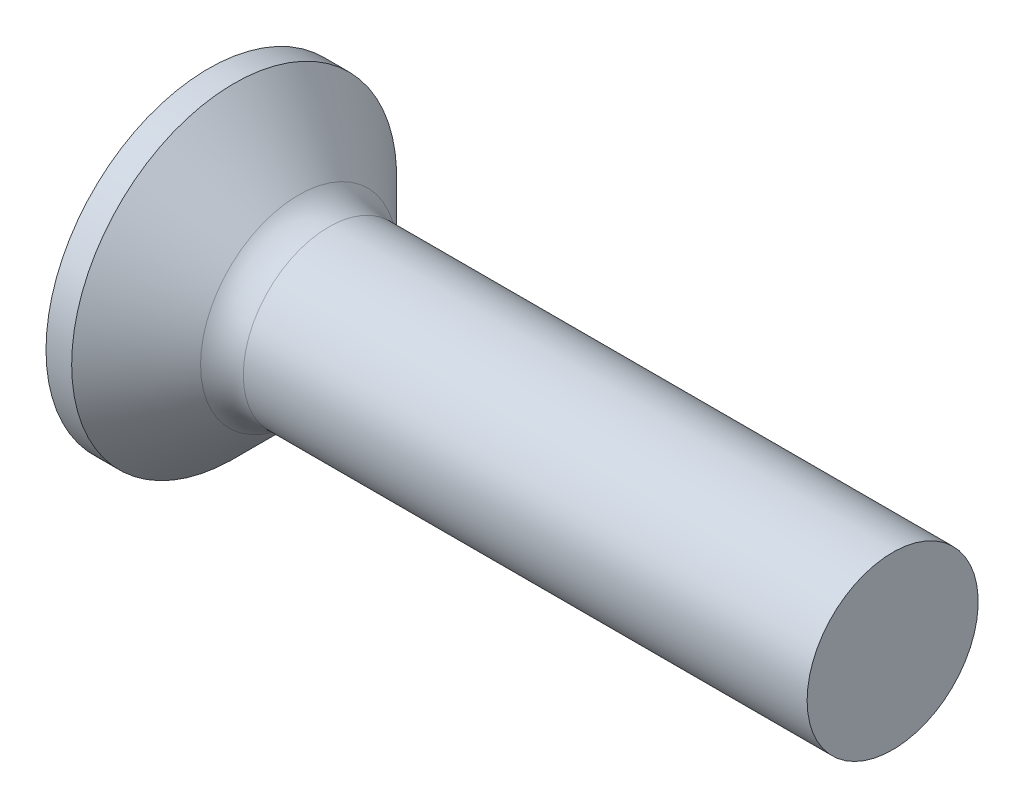
ISO-10303-21;
HEADER;
FILE_DESCRIPTION(('STEP AP214'),'2;1');
FILE_NAME('part.step','',(''),(''),'','','');
FILE_SCHEMA(('AUTOMOTIVE_DESIGN { 1 0 10303 214 1 1 1 1 }'));
ENDSEC;
DATA;
#1=APPLICATION_CONTEXT('core data for automotive mechanical design processes');
#2=APPLICATION_PROTOCOL_DEFINITION('international standard','automotive_design',2000,#1);
#3=PRODUCT_CONTEXT('',#1,'mechanical');
#4=PRODUCT('Part','Part','',(#3));
#5=PRODUCT_RELATED_PRODUCT_CATEGORY('part','',(#4));
#6=PRODUCT_DEFINITION_FORMATION('','',#4);
#7=PRODUCT_DEFINITION_CONTEXT('part definition',#1,'design');
#8=PRODUCT_DEFINITION('design','',#6,#7);
#9=PRODUCT_DEFINITION_SHAPE('','',#8);
#10=(LENGTH_UNIT() NAMED_UNIT(*) SI_UNIT(.MILLI.,.METRE.));
#11=(NAMED_UNIT(*) PLANE_ANGLE_UNIT() SI_UNIT($,.RADIAN.));
#12=(NAMED_UNIT(*) SI_UNIT($,.STERADIAN.) SOLID_ANGLE_UNIT());
#13=UNCERTAINTY_MEASURE_WITH_UNIT(LENGTH_MEASURE(1.E-05),#10,'distance_accuracy_value','');
#14=(GEOMETRIC_REPRESENTATION_CONTEXT(3) GLOBAL_UNCERTAINTY_ASSIGNED_CONTEXT((#13)) GLOBAL_UNIT_ASSIGNED_CONTEXT((#10,
#11,#12)) REPRESENTATION_CONTEXT('',''));
#15=CARTESIAN_POINT('',(0.,0.,0.));
#16=DIRECTION('',(0.,0.,1.));
#17=DIRECTION('',(1.,0.,0.));
#18=AXIS2_PLACEMENT_3D('',#15,#16,#17);
#19=CARTESIAN_POINT('',(0.,-0.949999999999999,0.24));
#20=DIRECTION('',(0.,0.,-1.));
#21=DIRECTION('',(0.,1.,0.));
#22=AXIS2_PLACEMENT_3D('',#19,#20,#21);
#23=PLANE('',#22);
#24=DIRECTION('',(0.,-1.,0.));
#25=VECTOR('',#24,1.);
#26=CARTESIAN_POINT('',(0.,0.95,0.24));
#27=LINE('',#26,#25);
#28=CARTESIAN_POINT('',(0.,-0.368080234393745,0.24));
#29=VERTEX_POINT('',#28);
#30=CARTESIAN_POINT('',(0.,-0.95,0.24));
#31=VERTEX_POINT('',#30);
#32=EDGE_CURVE('E458',#29,#31,#27,.T.);
#33=ORIENTED_EDGE('',*,*,#32,.F.);
#34=CARTESIAN_POINT('',(-0.647693210421638,-0.421114336989891,0.24));
#35=CARTESIAN_POINT('',(-0.514503449539822,-0.410390261082994,0.24));
#36=CARTESIAN_POINT('',(-0.381320940230654,-0.399574318210381,0.24));
#37=CARTESIAN_POINT('',(-0.114973765657541,-0.377686644384344,0.24));
#38=CARTESIAN_POINT('',(0.0181908991048064,-0.366614907333785,0.24));
#39=CARTESIAN_POINT('',(0.284492634007954,-0.344144100394554,0.24));
#40=CARTESIAN_POINT('',(0.417629704159725,-0.332745030636282,0.24));
#41=CARTESIAN_POINT('',(0.683863247577946,-0.309504122508032,0.24));
#42=CARTESIAN_POINT('',(0.816959721458451,-0.297662291208049,0.24));
#43=CARTESIAN_POINT('',(1.04303435438055,-0.277010154534468,0.24));
#44=CARTESIAN_POINT('',(1.13602713245196,-0.268360479226193,0.24));
#45=CARTESIAN_POINT('',(1.32197255819723,-0.250648380041589,0.24));
#46=CARTESIAN_POINT('',(1.41492520622595,-0.241585959893612,0.24));
#47=CARTESIAN_POINT('',(1.60078125425266,-0.222904447218474,0.24));
#48=CARTESIAN_POINT('',(1.69368465086432,-0.213285320435301,0.24));
#49=CARTESIAN_POINT('',(1.87939874419459,-0.193166747195666,0.24));
#50=CARTESIAN_POINT('',(1.97220943766423,-0.182667270910302,0.24));
#51=CARTESIAN_POINT('',(2.0649517678624,-0.171565852393332,0.24));
#52=B_SPLINE_CURVE_WITH_KNOTS('',3,(#34,#35,#36,#37,#38,#39,#40,#41,#42,#43,#44,#45,#46,#47,#48,
#49,#50,#51),.UNSPECIFIED.,.F.,.F.,(4,2,2,2,2,2,2,2,4),(0.,0.400862588724007,0.801734742325294,
1.2026067362345,1.60347233177046,1.88365413960954,2.16383341704974,2.44402995322111,
2.72423598713696),.UNSPECIFIED.);
#53=CARTESIAN_POINT('',(1.2,-0.262259890185288,0.240000000000001));
#54=VERTEX_POINT('',#53);
#55=EDGE_CURVE('E214',#29,#54,#52,.T.);
#56=ORIENTED_EDGE('',*,*,#55,.T.);
#57=DIRECTION('',(0.,-1.,0.));
#58=VECTOR('',#57,1.);
#59=CARTESIAN_POINT('',(1.2,0.351702170390125,0.24));
#60=LINE('',#59,#58);
#61=CARTESIAN_POINT('',(1.2,-0.351702170390124,0.24));
#62=VERTEX_POINT('',#61);
#63=EDGE_CURVE('E367',#54,#62,#60,.T.);
#64=ORIENTED_EDGE('',*,*,#63,.T.);
#65=DIRECTION('',(0.894934391398443,0.446197753347436,0.));
#66=VECTOR('',#65,1.);
#67=CARTESIAN_POINT('',(0.,-0.95,0.24));
#68=LINE('',#67,#66);
#69=EDGE_CURVE('E466',#31,#62,#68,.T.);
#70=ORIENTED_EDGE('',*,*,#69,.F.);
#71=EDGE_LOOP('',(#33,#56,#64,#70));
#72=FACE_BOUND('',#71,.T.);
#73=ADVANCED_FACE('F35',(#72),#23,.T.);
#74=CARTESIAN_POINT('',(1.2,0.351702170390125,0.24));
#75=VERTEX_POINT('',#74);
#76=CARTESIAN_POINT('',(1.2,0.262259890185288,0.24));
#77=VERTEX_POINT('',#76);
#78=EDGE_CURVE('E363',#75,#77,#60,.T.);
#79=ORIENTED_EDGE('',*,*,#78,.T.);
#80=CARTESIAN_POINT('',(-0.647693210421638,0.421114336989891,0.24));
#81=CARTESIAN_POINT('',(-0.514503449539821,0.410390261082994,0.24));
#82=CARTESIAN_POINT('',(-0.381320940230654,0.399574318210381,0.24));
#83=CARTESIAN_POINT('',(-0.114973765657541,0.377686644384344,0.24));
#84=CARTESIAN_POINT('',(0.0181908991048066,0.366614907333785,0.24));
#85=CARTESIAN_POINT('',(0.284492634007954,0.344144100394554,0.24));
#86=CARTESIAN_POINT('',(0.417629704159725,0.332745030636282,0.24));
#87=CARTESIAN_POINT('',(0.683863247577946,0.309504122508032,0.24));
#88=CARTESIAN_POINT('',(0.816959721458451,0.297662291208049,0.24));
#89=CARTESIAN_POINT('',(1.04303435438056,0.277010154534468,0.24));
#90=CARTESIAN_POINT('',(1.13602713245196,0.268360479226193,0.24));
#91=CARTESIAN_POINT('',(1.32197255819723,0.250648380041589,0.24));
#92=CARTESIAN_POINT('',(1.41492520622595,0.241585959893612,0.24));
#93=CARTESIAN_POINT('',(1.60078125425266,0.222904447218474,0.24));
#94=CARTESIAN_POINT('',(1.69368465086432,0.213285320435301,0.24));
#95=CARTESIAN_POINT('',(1.87939874419459,0.193166747195666,0.24));
#96=CARTESIAN_POINT('',(1.97220943766423,0.182667270910302,0.24));
#97=CARTESIAN_POINT('',(2.0649517678624,0.171565852393332,0.24));
#98=B_SPLINE_CURVE_WITH_KNOTS('',3,(#80,#81,#82,#83,#84,#85,#86,#87,#88,#89,#90,#91,#92,#93,#94,
#95,#96,#97),.UNSPECIFIED.,.F.,.F.,(4,2,2,2,2,2,2,2,4),(0.,0.400862588724007,0.801734742325293,
1.2026067362345,1.60347233177046,1.88365413960955,2.16383341704974,2.44402995322111,
2.72423598713696),.UNSPECIFIED.);
#99=CARTESIAN_POINT('',(0.,0.368080234393745,0.24));
#100=VERTEX_POINT('',#99);
#101=EDGE_CURVE('E207',#77,#100,#98,.F.);
#102=ORIENTED_EDGE('',*,*,#101,.T.);
#103=CARTESIAN_POINT('',(0.,0.95,0.24));
#104=VERTEX_POINT('',#103);
#105=EDGE_CURVE('E460',#104,#100,#27,.T.);
#106=ORIENTED_EDGE('',*,*,#105,.F.);
#107=DIRECTION('',(0.894934391398443,-0.446197753347436,0.));
#108=VECTOR('',#107,1.);
#109=CARTESIAN_POINT('',(0.,0.95,0.24));
#110=LINE('',#109,#108);
#111=EDGE_CURVE('E58',#104,#75,#110,.T.);
#112=ORIENTED_EDGE('',*,*,#111,.T.);
#113=EDGE_LOOP('',(#79,#102,#106,#112));
#114=FACE_BOUND('',#113,.T.);
#115=ADVANCED_FACE('F189',(#114),#23,.T.);
#116=CARTESIAN_POINT('',(0.,0.949999999999999,-0.24));
#117=DIRECTION('',(0.,0.,1.));
#118=DIRECTION('',(1.,0.,0.));
#119=AXIS2_PLACEMENT_3D('',#116,#117,#118);
#120=PLANE('',#119);
#121=DIRECTION('',(0.,1.,0.));
#122=VECTOR('',#121,1.);
#123=CARTESIAN_POINT('',(1.2,-0.351702170390124,-0.24));
#124=LINE('',#123,#122);
#125=CARTESIAN_POINT('',(1.2,-0.351702170390124,-0.24));
#126=VERTEX_POINT('',#125);
#127=CARTESIAN_POINT('',(1.2,-0.262259890185288,-0.24));
#128=VERTEX_POINT('',#127);
#129=EDGE_CURVE('E376',#126,#128,#124,.T.);
#130=ORIENTED_EDGE('',*,*,#129,.T.);
#131=CARTESIAN_POINT('',(-0.647693210421638,-0.421114336989891,-0.24));
#132=CARTESIAN_POINT('',(-0.514503449539821,-0.410390261082994,-0.24));
#133=CARTESIAN_POINT('',(-0.381320940230654,-0.399574318210381,-0.24));
#134=CARTESIAN_POINT('',(-0.114973765657541,-0.377686644384344,-0.24));
#135=CARTESIAN_POINT('',(0.0181908991048065,-0.366614907333785,-0.24));
#136=CARTESIAN_POINT('',(0.284492634007954,-0.344144100394554,-0.24));
#137=CARTESIAN_POINT('',(0.417629704159725,-0.332745030636282,-0.24));
#138=CARTESIAN_POINT('',(0.683863247577946,-0.309504122508032,-0.24));
#139=CARTESIAN_POINT('',(0.816959721458451,-0.297662291208049,-0.24));
#140=CARTESIAN_POINT('',(1.04303435438056,-0.277010154534468,-0.24));
#141=CARTESIAN_POINT('',(1.13602713245196,-0.268360479226193,-0.24));
#142=CARTESIAN_POINT('',(1.32197255819723,-0.250648380041589,-0.24));
#143=CARTESIAN_POINT('',(1.41492520622595,-0.241585959893612,-0.24));
#144=CARTESIAN_POINT('',(1.60078125425266,-0.222904447218474,-0.24));
#145=CARTESIAN_POINT('',(1.69368465086432,-0.213285320435301,-0.24));
#146=CARTESIAN_POINT('',(1.87939874419459,-0.193166747195666,-0.24));
#147=CARTESIAN_POINT('',(1.97220943766423,-0.182667270910302,-0.24));
#148=CARTESIAN_POINT('',(2.0649517678624,-0.171565852393332,-0.24));
#149=B_SPLINE_CURVE_WITH_KNOTS('',3,(#131,#132,#133,#134,#135,#136,#137,#138,#139,#140,#141,
#142,#143,#144,#145,#146,#147,#148),.UNSPECIFIED.,.F.,.F.,(4,2,2,2,2,2,2,2,4),(0.,
0.400862588724007,0.801734742325294,1.2026067362345,1.60347233177046,1.88365413960954,
2.16383341704974,2.44402995322111,2.72423598713696),.UNSPECIFIED.);
#150=CARTESIAN_POINT('',(0.,-0.368080234393745,-0.24));
#151=VERTEX_POINT('',#150);
#152=EDGE_CURVE('E270',#128,#151,#149,.F.);
#153=ORIENTED_EDGE('',*,*,#152,.T.);
#154=DIRECTION('',(0.,1.,0.));
#155=VECTOR('',#154,1.);
#156=CARTESIAN_POINT('',(0.,-0.95,-0.24));
#157=LINE('',#156,#155);
#158=CARTESIAN_POINT('',(0.,-0.95,-0.24));
#159=VERTEX_POINT('',#158);
#160=EDGE_CURVE('E459',#159,#151,#157,.T.);
#161=ORIENTED_EDGE('',*,*,#160,.F.);
#162=DIRECTION('',(0.894934391398443,0.446197753347436,0.));
#163=VECTOR('',#162,1.);
#164=CARTESIAN_POINT('',(0.,-0.95,-0.24));
#165=LINE('',#164,#163);
#166=EDGE_CURVE('E469',#159,#126,#165,.T.);
#167=ORIENTED_EDGE('',*,*,#166,.T.);
#168=EDGE_LOOP('',(#130,#153,#161,#167));
#169=FACE_BOUND('',#168,.T.);
#170=ADVANCED_FACE('F195',(#169),#120,.T.);
#171=CARTESIAN_POINT('',(0.,0.368080234393745,-0.24));
#172=VERTEX_POINT('',#171);
#173=CARTESIAN_POINT('',(0.,0.95,-0.24));
#174=VERTEX_POINT('',#173);
#175=EDGE_CURVE('E465',#172,#174,#157,.T.);
#176=ORIENTED_EDGE('',*,*,#175,.F.);
#177=CARTESIAN_POINT('',(-0.647693210410767,0.421114336989016,-0.24));
#178=CARTESIAN_POINT('',(-0.514503449530112,0.410390261082207,-0.24));
#179=CARTESIAN_POINT('',(-0.381320940222106,0.399574318209684,-0.24));
#180=CARTESIAN_POINT('',(-0.114973765651316,0.377686644383828,-0.24));
#181=CARTESIAN_POINT('',(0.0181908991098698,0.366614907333361,-0.24));
#182=CARTESIAN_POINT('',(0.284492634009302,0.344144100394437,-0.24));
#183=CARTESIAN_POINT('',(0.417629704158519,0.332745030636383,-0.24));
#184=CARTESIAN_POINT('',(0.683863247571635,0.309504122508587,-0.24));
#185=CARTESIAN_POINT('',(0.816959721449588,0.29766229120884,-0.24));
#186=CARTESIAN_POINT('',(1.04303435436914,0.277010154535523,-0.24));
#187=CARTESIAN_POINT('',(1.13602713244054,0.268360479227263,-0.24));
#188=CARTESIAN_POINT('',(1.32197255818582,0.250648380042693,-0.24));
#189=CARTESIAN_POINT('',(1.41492520621454,0.241585959894735,-0.24));
#190=CARTESIAN_POINT('',(1.60078125424125,0.222904447219644,-0.24));
#191=CARTESIAN_POINT('',(1.69368465085292,0.213285320436499,-0.24));
#192=CARTESIAN_POINT('',(1.8793987441832,0.193166747196934,-0.24));
#193=CARTESIAN_POINT('',(1.97220943765284,0.182667270911615,-0.24));
#194=CARTESIAN_POINT('',(2.06495176785102,0.171565852394701,-0.24));
#195=B_SPLINE_CURVE_WITH_KNOTS('',3,(#177,#178,#179,#180,#181,#182,#183,#184,#185,#186,#187,
#188,#189,#190,#191,#192,#193,#194),.UNSPECIFIED.,.F.,.F.,(4,2,2,2,2,2,2,2,4),(0.,
0.400862588720512,0.801734742318303,1.20260673621982,1.60347233174809,1.88365413958718,
2.16383341702737,2.44402995319874,2.72423598711459),.UNSPECIFIED.);
#196=CARTESIAN_POINT('',(1.2,0.262259890185288,-0.24));
#197=VERTEX_POINT('',#196);
#198=EDGE_CURVE('E264',#172,#197,#195,.T.);
#199=ORIENTED_EDGE('',*,*,#198,.T.);
#200=CARTESIAN_POINT('',(1.2,0.351702170390125,-0.24));
#201=VERTEX_POINT('',#200);
#202=EDGE_CURVE('E378',#197,#201,#124,.T.);
#203=ORIENTED_EDGE('',*,*,#202,.T.);
#204=DIRECTION('',(0.894934391398443,-0.446197753347436,0.));
#205=VECTOR('',#204,1.);
#206=CARTESIAN_POINT('',(0.,0.95,-0.24));
#207=LINE('',#206,#205);
#208=EDGE_CURVE('E375',#174,#201,#207,.T.);
#209=ORIENTED_EDGE('',*,*,#208,.F.);
#210=EDGE_LOOP('',(#176,#199,#203,#209));
#211=FACE_BOUND('',#210,.T.);
#212=ADVANCED_FACE('F476',(#211),#120,.T.);
#213=CARTESIAN_POINT('',(1.2,0.351702170390125,-0.24));
#214=DIRECTION('',(1.,0.,0.));
#215=DIRECTION('',(0.,0.,-1.));
#216=AXIS2_PLACEMENT_3D('',#213,#214,#215);
#217=PLANE('',#216);
#218=CARTESIAN_POINT('',(1.2,0.,0.));
#219=DIRECTION('',(-1.,0.,0.));
#220=DIRECTION('',(0.,0.,1.));
#221=AXIS2_PLACEMENT_3D('',#218,#219,#220);
#222=CIRCLE('',#221,0.355499999999999);
#223=CARTESIAN_POINT('',(1.2,-0.0518250262216575,-0.351702170390124));
#224=VERTEX_POINT('',#223);
#225=CARTESIAN_POINT('',(1.2,-0.239999999999999,-0.262259890185289));
#226=VERTEX_POINT('',#225);
#227=EDGE_CURVE('E342',#224,#226,#222,.T.);
#228=ORIENTED_EDGE('',*,*,#227,.F.);
#229=DIRECTION('',(0.,1.,0.));
#230=VECTOR('',#229,1.);
#231=CARTESIAN_POINT('',(1.2,-0.239999999999999,-0.351702170390125));
#232=LINE('',#231,#230);
#233=CARTESIAN_POINT('',(1.2,-0.239999999999999,-0.351702170390125));
#234=VERTEX_POINT('',#233);
#235=EDGE_CURVE('E443',#234,#224,#232,.T.);
#236=ORIENTED_EDGE('',*,*,#235,.F.);
#237=DIRECTION('',(0.,0.,-1.));
#238=VECTOR('',#237,1.);
#239=CARTESIAN_POINT('',(1.2,-0.240000000000001,0.351702170390124));
#240=LINE('',#239,#238);
#241=EDGE_CURVE('E447',#226,#234,#240,.T.);
#242=ORIENTED_EDGE('',*,*,#241,.F.);
#243=EDGE_LOOP('',(#228,#236,#242));
#244=FACE_BOUND('',#243,.T.);
#245=ADVANCED_FACE('F489',(#244),#217,.F.);
#246=CARTESIAN_POINT('',(1.2,-0.351702170390124,-0.0518250262216578));
#247=VERTEX_POINT('',#246);
#248=EDGE_CURVE('E337',#128,#247,#222,.T.);
#249=ORIENTED_EDGE('',*,*,#248,.F.);
#250=ORIENTED_EDGE('',*,*,#129,.F.);
#251=DIRECTION('',(0.,0.,-1.));
#252=VECTOR('',#251,1.);
#253=CARTESIAN_POINT('',(1.2,-0.351702170390124,0.24));
#254=LINE('',#253,#252);
#255=EDGE_CURVE('E366',#247,#126,#254,.T.);
#256=ORIENTED_EDGE('',*,*,#255,.F.);
#257=EDGE_LOOP('',(#249,#250,#256));
#258=FACE_BOUND('',#257,.T.);
#259=ADVANCED_FACE('F495',(#258),#217,.F.);
#260=CARTESIAN_POINT('',(1.2,-0.351702170390124,0.051825026221658));
#261=VERTEX_POINT('',#260);
#262=EDGE_CURVE('E332',#261,#54,#222,.T.);
#263=ORIENTED_EDGE('',*,*,#262,.F.);
#264=EDGE_CURVE('E369',#62,#261,#254,.T.);
#265=ORIENTED_EDGE('',*,*,#264,.F.);
#266=ORIENTED_EDGE('',*,*,#63,.F.);
#267=EDGE_LOOP('',(#263,#265,#266));
#268=FACE_BOUND('',#267,.T.);
#269=ADVANCED_FACE('F501',(#268),#217,.F.);
#270=CARTESIAN_POINT('',(1.2,-0.240000000000001,0.262259890185288));
#271=VERTEX_POINT('',#270);
#272=CARTESIAN_POINT('',(1.2,-0.0518250262216527,0.351702170390124));
#273=VERTEX_POINT('',#272);
#274=EDGE_CURVE('E50',#271,#273,#222,.T.);
#275=ORIENTED_EDGE('',*,*,#274,.F.);
#276=CARTESIAN_POINT('',(1.2,-0.240000000000001,0.351702170390124));
#277=VERTEX_POINT('',#276);
#278=EDGE_CURVE('E449',#277,#271,#240,.T.);
#279=ORIENTED_EDGE('',*,*,#278,.F.);
#280=DIRECTION('',(0.,-1.,0.));
#281=VECTOR('',#280,1.);
#282=CARTESIAN_POINT('',(1.2,0.239999999999999,0.351702170390125));
#283=LINE('',#282,#281);
#284=EDGE_CURVE('E448',#273,#277,#283,.T.);
#285=ORIENTED_EDGE('',*,*,#284,.F.);
#286=EDGE_LOOP('',(#275,#279,#285));
#287=FACE_BOUND('',#286,.T.);
#288=ADVANCED_FACE('F528',(#287),#217,.F.);
#289=CARTESIAN_POINT('',(1.2,0.0518250262216552,0.351702170390125));
#290=VERTEX_POINT('',#289);
#291=CARTESIAN_POINT('',(1.2,0.239999999999999,0.262259890185289));
#292=VERTEX_POINT('',#291);
#293=EDGE_CURVE('E323',#290,#292,#222,.T.);
#294=ORIENTED_EDGE('',*,*,#293,.F.);
#295=CARTESIAN_POINT('',(1.2,0.239999999999999,0.351702170390125));
#296=VERTEX_POINT('',#295);
#297=EDGE_CURVE('E444',#296,#290,#283,.T.);
#298=ORIENTED_EDGE('',*,*,#297,.F.);
#299=DIRECTION('',(0.,0.,1.));
#300=VECTOR('',#299,1.);
#301=CARTESIAN_POINT('',(1.2,0.240000000000001,-0.351702170390123));
#302=LINE('',#301,#300);
#303=EDGE_CURVE('E221',#292,#296,#302,.T.);
#304=ORIENTED_EDGE('',*,*,#303,.F.);
#305=EDGE_LOOP('',(#294,#298,#304));
#306=FACE_BOUND('',#305,.T.);
#307=ADVANCED_FACE('F485',(#306),#217,.F.);
#308=CARTESIAN_POINT('',(1.2,0.351702170390125,0.051825026221656));
#309=VERTEX_POINT('',#308);
#310=EDGE_CURVE('E330',#77,#309,#222,.T.);
#311=ORIENTED_EDGE('',*,*,#310,.F.);
#312=ORIENTED_EDGE('',*,*,#78,.F.);
#313=DIRECTION('',(0.,0.,1.));
#314=VECTOR('',#313,1.);
#315=CARTESIAN_POINT('',(1.2,0.351702170390125,-0.24));
#316=LINE('',#315,#314);
#317=EDGE_CURVE('E364',#309,#75,#316,.T.);
#318=ORIENTED_EDGE('',*,*,#317,.F.);
#319=EDGE_LOOP('',(#311,#312,#318));
#320=FACE_BOUND('',#319,.T.);
#321=ADVANCED_FACE('F362',(#320),#217,.F.);
#322=CARTESIAN_POINT('',(1.2,0.351702170390125,-0.0518250262216562));
#323=VERTEX_POINT('',#322);
#324=EDGE_CURVE('E352',#323,#197,#222,.T.);
#325=ORIENTED_EDGE('',*,*,#324,.F.);
#326=EDGE_CURVE('E371',#201,#323,#316,.T.);
#327=ORIENTED_EDGE('',*,*,#326,.F.);
#328=ORIENTED_EDGE('',*,*,#202,.F.);
#329=EDGE_LOOP('',(#325,#327,#328));
#330=FACE_BOUND('',#329,.T.);
#331=ADVANCED_FACE('F478',(#330),#217,.F.);
#332=CARTESIAN_POINT('',(0.,-0.95,-0.24));
#333=DIRECTION('',(-0.446197753347436,0.894934391398443,0.));
#334=DIRECTION('',(-0.894934391398443,-0.446197753347436,0.));
#335=AXIS2_PLACEMENT_3D('',#332,#333,#334);
#336=PLANE('',#335);
#337=ORIENTED_EDGE('',*,*,#264,.T.);
#338=CARTESIAN_POINT('',(1.81755053455844,-0.0438028833061812,0.));
#339=DIRECTION('',(-0.446197753347436,0.894934391398443,0.));
#340=DIRECTION('',(-0.894934391398443,-0.446197753347436,0.));
#341=AXIS2_PLACEMENT_3D('',#338,#339,#340);
#342=ELLIPSE('',#341,0.69995121571384,0.309229693703333);
#343=EDGE_CURVE('E282',#261,#247,#342,.F.);
#344=ORIENTED_EDGE('',*,*,#343,.T.);
#345=ORIENTED_EDGE('',*,*,#255,.T.);
#346=ORIENTED_EDGE('',*,*,#166,.F.);
#347=DIRECTION('',(0.,0.,-1.));
#348=VECTOR('',#347,1.);
#349=CARTESIAN_POINT('',(0.,-0.95,0.24));
#350=LINE('',#349,#348);
#351=EDGE_CURVE('E383',#31,#159,#350,.T.);
#352=ORIENTED_EDGE('',*,*,#351,.F.);
#353=ORIENTED_EDGE('',*,*,#69,.T.);
#354=EDGE_LOOP('',(#337,#344,#345,#346,#352,#353));
#355=FACE_BOUND('',#354,.T.);
#356=ADVANCED_FACE('F201',(#355),#336,.T.);
#357=CARTESIAN_POINT('',(0.,0.95,0.24));
#358=DIRECTION('',(-0.446197753347436,-0.894934391398443,0.));
#359=DIRECTION('',(0.894934391398443,-0.446197753347436,0.));
#360=AXIS2_PLACEMENT_3D('',#357,#358,#359);
#361=PLANE('',#360);
#362=ORIENTED_EDGE('',*,*,#326,.T.);
#363=CARTESIAN_POINT('',(1.81755053455844,0.0438028833061814,0.));
#364=DIRECTION('',(-0.446197753347436,-0.894934391398443,0.));
#365=DIRECTION('',(-0.894934391398443,0.446197753347436,0.));
#366=AXIS2_PLACEMENT_3D('',#363,#364,#365);
#367=ELLIPSE('',#366,0.69995121571384,0.309229693703333);
#368=EDGE_CURVE('E287',#323,#309,#367,.F.);
#369=ORIENTED_EDGE('',*,*,#368,.T.);
#370=ORIENTED_EDGE('',*,*,#317,.T.);
#371=ORIENTED_EDGE('',*,*,#111,.F.);
#372=DIRECTION('',(0.,0.,1.));
#373=VECTOR('',#372,1.);
#374=CARTESIAN_POINT('',(0.,0.95,-0.24));
#375=LINE('',#374,#373);
#376=EDGE_CURVE('E455',#174,#104,#375,.T.);
#377=ORIENTED_EDGE('',*,*,#376,.F.);
#378=ORIENTED_EDGE('',*,*,#208,.T.);
#379=EDGE_LOOP('',(#362,#369,#370,#371,#377,#378));
#380=FACE_BOUND('',#379,.T.);
#381=ADVANCED_FACE('F474',(#380),#361,.T.);
#382=CARTESIAN_POINT('',(0.,0.239999999999997,0.95));
#383=DIRECTION('',(0.,-1.,0.));
#384=DIRECTION('',(1.,0.,0.));
#385=AXIS2_PLACEMENT_3D('',#382,#383,#384);
#386=PLANE('',#385);
#387=CARTESIAN_POINT('',(1.2,0.240000000000001,-0.351702170390123));
#388=VERTEX_POINT('',#387);
#389=CARTESIAN_POINT('',(1.2,0.240000000000001,-0.262259890185288));
#390=VERTEX_POINT('',#389);
#391=EDGE_CURVE('E453',#388,#390,#302,.T.);
#392=ORIENTED_EDGE('',*,*,#391,.T.);
#393=CARTESIAN_POINT('',(-0.647693210421638,0.240000000000001,-0.42111433698989));
#394=CARTESIAN_POINT('',(-0.514503449539822,0.240000000000001,-0.410390261082993));
#395=CARTESIAN_POINT('',(-0.381320940230654,0.240000000000001,-0.399574318210381));
#396=CARTESIAN_POINT('',(-0.114973765657541,0.240000000000001,-0.377686644384343));
#397=CARTESIAN_POINT('',(0.0181908991048064,0.240000000000001,-0.366614907333784));
#398=CARTESIAN_POINT('',(0.284492634007954,0.240000000000001,-0.344144100394553));
#399=CARTESIAN_POINT('',(0.417629704159725,0.240000000000001,-0.332745030636281));
#400=CARTESIAN_POINT('',(0.683863247577946,0.240000000000001,-0.309504122508031));
#401=CARTESIAN_POINT('',(0.816959721458451,0.240000000000001,-0.297662291208048));
#402=CARTESIAN_POINT('',(1.04303435438056,0.240000000000001,-0.277010154534467));
#403=CARTESIAN_POINT('',(1.13602713245196,0.240000000000001,-0.268360479226192));
#404=CARTESIAN_POINT('',(1.32197255819723,0.240000000000001,-0.250648380041589));
#405=CARTESIAN_POINT('',(1.41492520622595,0.240000000000001,-0.241585959893611));
#406=CARTESIAN_POINT('',(1.60078125425266,0.240000000000001,-0.222904447218473));
#407=CARTESIAN_POINT('',(1.69368465086432,0.240000000000001,-0.213285320435301));
#408=CARTESIAN_POINT('',(1.87939874419459,0.240000000000001,-0.193166747195665));
#409=CARTESIAN_POINT('',(1.97220943766423,0.240000000000001,-0.182667270910301));
#410=CARTESIAN_POINT('',(2.0649517678624,0.240000000000001,-0.171565852393331));
#411=B_SPLINE_CURVE_WITH_KNOTS('',3,(#393,#394,#395,#396,#397,#398,#399,#400,#401,#402,#403,
#404,#405,#406,#407,#408,#409,#410),.UNSPECIFIED.,.F.,.F.,(4,2,2,2,2,2,2,2,4),(0.,
0.400862588724007,0.801734742325294,1.2026067362345,1.60347233177046,1.88365413960954,
2.16383341704974,2.44402995322111,2.72423598713696),.UNSPECIFIED.);
#412=CARTESIAN_POINT('',(0.,0.240000000000001,-0.368080234393745));
#413=VERTEX_POINT('',#412);
#414=EDGE_CURVE('E256',#390,#413,#411,.F.);
#415=ORIENTED_EDGE('',*,*,#414,.T.);
#416=DIRECTION('',(0.,0.,1.));
#417=VECTOR('',#416,1.);
#418=CARTESIAN_POINT('',(0.,0.240000000000003,-0.949999999999999));
#419=LINE('',#418,#417);
#420=CARTESIAN_POINT('',(0.,0.240000000000003,-0.949999999999999));
#421=VERTEX_POINT('',#420);
#422=EDGE_CURVE('E429',#421,#413,#419,.T.);
#423=ORIENTED_EDGE('',*,*,#422,.F.);
#424=DIRECTION('',(0.894934391398443,0.,0.446197753347436));
#425=VECTOR('',#424,1.);
#426=CARTESIAN_POINT('',(0.,0.240000000000003,-0.949999999999999));
#427=LINE('',#426,#425);
#428=EDGE_CURVE('E435',#421,#388,#427,.T.);
#429=ORIENTED_EDGE('',*,*,#428,.T.);
#430=EDGE_LOOP('',(#392,#415,#423,#429));
#431=FACE_BOUND('',#430,.T.);
#432=ADVANCED_FACE('F608',(#431),#386,.T.);
#433=CARTESIAN_POINT('',(0.,-0.239999999999997,-0.95));
#434=DIRECTION('',(0.,1.,0.));
#435=DIRECTION('',(0.,0.,1.));
#436=AXIS2_PLACEMENT_3D('',#433,#434,#435);
#437=PLANE('',#436);
#438=DIRECTION('',(0.,0.,-1.));
#439=VECTOR('',#438,1.);
#440=CARTESIAN_POINT('',(0.,-0.240000000000003,0.949999999999999));
#441=LINE('',#440,#439);
#442=CARTESIAN_POINT('',(0.,-0.239999999999999,-0.368080234393746));
#443=VERTEX_POINT('',#442);
#444=CARTESIAN_POINT('',(0.,-0.239999999999997,-0.950000000000001));
#445=VERTEX_POINT('',#444);
#446=EDGE_CURVE('E425',#443,#445,#441,.T.);
#447=ORIENTED_EDGE('',*,*,#446,.F.);
#448=CARTESIAN_POINT('',(-0.647693210410766,-0.239999999999999,-0.421114336989017));
#449=CARTESIAN_POINT('',(-0.514503449530112,-0.239999999999999,-0.410390261082208));
#450=CARTESIAN_POINT('',(-0.381320940222106,-0.239999999999999,-0.399574318209684));
#451=CARTESIAN_POINT('',(-0.114973765651316,-0.239999999999999,-0.377686644383829));
#452=CARTESIAN_POINT('',(0.0181908991098697,-0.239999999999999,-0.366614907333361));
#453=CARTESIAN_POINT('',(0.284492634009302,-0.239999999999999,-0.344144100394438));
#454=CARTESIAN_POINT('',(0.417629704158519,-0.239999999999999,-0.332745030636384));
#455=CARTESIAN_POINT('',(0.683863247571635,-0.239999999999999,-0.309504122508588));
#456=CARTESIAN_POINT('',(0.816959721449588,-0.239999999999999,-0.297662291208841));
#457=CARTESIAN_POINT('',(1.04303435436914,-0.239999999999999,-0.277010154535524));
#458=CARTESIAN_POINT('',(1.13602713244054,-0.239999999999999,-0.268360479227263));
#459=CARTESIAN_POINT('',(1.32197255818582,-0.239999999999999,-0.250648380042694));
#460=CARTESIAN_POINT('',(1.41492520621454,-0.239999999999999,-0.241585959894736));
#461=CARTESIAN_POINT('',(1.60078125424125,-0.239999999999999,-0.222904447219645));
#462=CARTESIAN_POINT('',(1.69368465085292,-0.239999999999999,-0.2132853204365));
#463=CARTESIAN_POINT('',(1.8793987441832,-0.239999999999999,-0.193166747196935));
#464=CARTESIAN_POINT('',(1.97220943765284,-0.239999999999999,-0.182667270911615));
#465=CARTESIAN_POINT('',(2.06495176785102,-0.239999999999999,-0.171565852394701));
#466=B_SPLINE_CURVE_WITH_KNOTS('',3,(#448,#449,#450,#451,#452,#453,#454,#455,#456,#457,#458,
#459,#460,#461,#462,#463,#464,#465),.UNSPECIFIED.,.F.,.F.,(4,2,2,2,2,2,2,2,4),(0.,
0.400862588720512,0.801734742318303,1.20260673621982,1.60347233174809,1.88365413958718,
2.16383341702737,2.44402995319874,2.72423598711459),.UNSPECIFIED.);
#467=EDGE_CURVE('E249',#443,#226,#466,.T.);
#468=ORIENTED_EDGE('',*,*,#467,.T.);
#469=ORIENTED_EDGE('',*,*,#241,.T.);
#470=DIRECTION('',(0.894934391398443,0.,0.446197753347436));
#471=VECTOR('',#470,1.);
#472=CARTESIAN_POINT('',(0.,-0.239999999999997,-0.950000000000001));
#473=LINE('',#472,#471);
#474=EDGE_CURVE('E432',#445,#234,#473,.T.);
#475=ORIENTED_EDGE('',*,*,#474,.F.);
#476=EDGE_LOOP('',(#447,#468,#469,#475));
#477=FACE_BOUND('',#476,.T.);
#478=ADVANCED_FACE('F506',(#477),#437,.T.);
#479=CARTESIAN_POINT('',(0.,0.240000000000003,-0.949999999999999));
#480=DIRECTION('',(-0.446197753347436,0.,0.894934391398443));
#481=DIRECTION('',(-0.894934391398443,0.,-0.446197753347436));
#482=AXIS2_PLACEMENT_3D('',#479,#480,#481);
#483=PLANE('',#482);
#484=ORIENTED_EDGE('',*,*,#235,.T.);
#485=CARTESIAN_POINT('',(1.81755053455844,0.,-0.0438028833061812));
#486=DIRECTION('',(-0.446197753347436,0.,0.894934391398443));
#487=DIRECTION('',(-0.894934391398443,0.,-0.446197753347436));
#488=AXIS2_PLACEMENT_3D('',#485,#486,#487);
#489=ELLIPSE('',#488,0.69995121571384,0.309229693703333);
#490=CARTESIAN_POINT('',(1.2,0.0518250262216598,-0.351702170390124));
#491=VERTEX_POINT('',#490);
#492=EDGE_CURVE('E300',#224,#491,#489,.F.);
#493=ORIENTED_EDGE('',*,*,#492,.T.);
#494=EDGE_CURVE('E451',#491,#388,#232,.T.);
#495=ORIENTED_EDGE('',*,*,#494,.T.);
#496=ORIENTED_EDGE('',*,*,#428,.F.);
#497=DIRECTION('',(0.,1.,0.));
#498=VECTOR('',#497,1.);
#499=CARTESIAN_POINT('',(0.,-0.239999999999997,-0.950000000000001));
#500=LINE('',#499,#498);
#501=EDGE_CURVE('E424',#445,#421,#500,.T.);
#502=ORIENTED_EDGE('',*,*,#501,.F.);
#503=ORIENTED_EDGE('',*,*,#474,.T.);
#504=EDGE_LOOP('',(#484,#493,#495,#496,#502,#503));
#505=FACE_BOUND('',#504,.T.);
#506=ADVANCED_FACE('F226',(#505),#483,.T.);
#507=ORIENTED_EDGE('',*,*,#278,.T.);
#508=CARTESIAN_POINT('',(-0.647693210421638,-0.240000000000001,0.42111433698989));
#509=CARTESIAN_POINT('',(-0.514503449539822,-0.240000000000001,0.410390261082993));
#510=CARTESIAN_POINT('',(-0.381320940230654,-0.240000000000001,0.39957431821038));
#511=CARTESIAN_POINT('',(-0.114973765657541,-0.240000000000001,0.377686644384343));
#512=CARTESIAN_POINT('',(0.0181908991048064,-0.240000000000001,0.366614907333784));
#513=CARTESIAN_POINT('',(0.284492634007953,-0.240000000000001,0.344144100394553));
#514=CARTESIAN_POINT('',(0.417629704159725,-0.240000000000001,0.332745030636281));
#515=CARTESIAN_POINT('',(0.683863247577946,-0.240000000000001,0.309504122508031));
#516=CARTESIAN_POINT('',(0.816959721458451,-0.240000000000001,0.297662291208048));
#517=CARTESIAN_POINT('',(1.04303435438056,-0.240000000000001,0.277010154534467));
#518=CARTESIAN_POINT('',(1.13602713245196,-0.240000000000001,0.268360479226192));
#519=CARTESIAN_POINT('',(1.32197255819723,-0.240000000000001,0.250648380041589));
#520=CARTESIAN_POINT('',(1.41492520622595,-0.240000000000001,0.241585959893611));
#521=CARTESIAN_POINT('',(1.60078125425266,-0.240000000000001,0.222904447218473));
#522=CARTESIAN_POINT('',(1.69368465086432,-0.240000000000001,0.213285320435301));
#523=CARTESIAN_POINT('',(1.87939874419459,-0.240000000000001,0.193166747195665));
#524=CARTESIAN_POINT('',(1.97220943766423,-0.240000000000001,0.182667270910301));
#525=CARTESIAN_POINT('',(2.0649517678624,-0.240000000000001,0.171565852393331));
#526=B_SPLINE_CURVE_WITH_KNOTS('',3,(#508,#509,#510,#511,#512,#513,#514,#515,#516,#517,#518,
#519,#520,#521,#522,#523,#524,#525),.UNSPECIFIED.,.F.,.F.,(4,2,2,2,2,2,2,2,4),(0.,
0.400862588724007,0.801734742325293,1.2026067362345,1.60347233177046,1.88365413960955,
2.16383341704974,2.44402995322111,2.72423598713696),.UNSPECIFIED.);
#527=CARTESIAN_POINT('',(0.,-0.240000000000001,0.368080234393745));
#528=VERTEX_POINT('',#527);
#529=EDGE_CURVE('E241',#271,#528,#526,.F.);
#530=ORIENTED_EDGE('',*,*,#529,.T.);
#531=CARTESIAN_POINT('',(0.,-0.240000000000003,0.949999999999999));
#532=VERTEX_POINT('',#531);
#533=EDGE_CURVE('E420',#532,#528,#441,.T.);
#534=ORIENTED_EDGE('',*,*,#533,.F.);
#535=DIRECTION('',(0.894934391398443,0.,-0.446197753347436));
#536=VECTOR('',#535,1.);
#537=CARTESIAN_POINT('',(0.,-0.240000000000003,0.949999999999999));
#538=LINE('',#537,#536);
#539=EDGE_CURVE('E438',#532,#277,#538,.T.);
#540=ORIENTED_EDGE('',*,*,#539,.T.);
#541=EDGE_LOOP('',(#507,#530,#534,#540));
#542=FACE_BOUND('',#541,.T.);
#543=ADVANCED_FACE('F526',(#542),#437,.T.);
#544=CARTESIAN_POINT('',(0.,0.239999999999999,0.368080234393746));
#545=VERTEX_POINT('',#544);
#546=CARTESIAN_POINT('',(0.,0.239999999999997,0.950000000000001));
#547=VERTEX_POINT('',#546);
#548=EDGE_CURVE('E431',#545,#547,#419,.T.);
#549=ORIENTED_EDGE('',*,*,#548,.F.);
#550=CARTESIAN_POINT('',(-0.647693210421638,0.239999999999998,0.421114336989892));
#551=CARTESIAN_POINT('',(-0.514503449539821,0.239999999999998,0.410390261082995));
#552=CARTESIAN_POINT('',(-0.381320940230654,0.239999999999998,0.399574318210382));
#553=CARTESIAN_POINT('',(-0.114973765657541,0.239999999999999,0.377686644384345));
#554=CARTESIAN_POINT('',(0.0181908991048066,0.239999999999999,0.366614907333785));
#555=CARTESIAN_POINT('',(0.284492634007954,0.239999999999999,0.344144100394555));
#556=CARTESIAN_POINT('',(0.417629704159725,0.239999999999999,0.332745030636283));
#557=CARTESIAN_POINT('',(0.683863247577946,0.239999999999999,0.309504122508033));
#558=CARTESIAN_POINT('',(0.816959721458451,0.239999999999999,0.29766229120805));
#559=CARTESIAN_POINT('',(1.04303435438056,0.239999999999999,0.277010154534469));
#560=CARTESIAN_POINT('',(1.13602713245196,0.239999999999999,0.268360479226194));
#561=CARTESIAN_POINT('',(1.32197255819723,0.239999999999999,0.25064838004159));
#562=CARTESIAN_POINT('',(1.41492520622595,0.239999999999999,0.241585959893613));
#563=CARTESIAN_POINT('',(1.60078125425266,0.239999999999999,0.222904447218474));
#564=CARTESIAN_POINT('',(1.69368465086432,0.239999999999999,0.213285320435302));
#565=CARTESIAN_POINT('',(1.87939874419459,0.239999999999999,0.193166747195667));
#566=CARTESIAN_POINT('',(1.97220943766423,0.239999999999999,0.182667270910303));
#567=CARTESIAN_POINT('',(2.0649517678624,0.239999999999999,0.171565852393333));
#568=B_SPLINE_CURVE_WITH_KNOTS('',3,(#550,#551,#552,#553,#554,#555,#556,#557,#558,#559,#560,
#561,#562,#563,#564,#565,#566,#567),.UNSPECIFIED.,.F.,.F.,(4,2,2,2,2,2,2,2,4),(0.,
0.400862588724007,0.801734742325293,1.2026067362345,1.60347233177046,1.88365413960955,
2.16383341704974,2.44402995322111,2.72423598713696),.UNSPECIFIED.);
#569=EDGE_CURVE('E231',#545,#292,#568,.T.);
#570=ORIENTED_EDGE('',*,*,#569,.T.);
#571=ORIENTED_EDGE('',*,*,#303,.T.);
#572=DIRECTION('',(0.894934391398443,0.,-0.446197753347436));
#573=VECTOR('',#572,1.);
#574=CARTESIAN_POINT('',(0.,0.239999999999997,0.950000000000001));
#575=LINE('',#574,#573);
#576=EDGE_CURVE('E440',#547,#296,#575,.T.);
#577=ORIENTED_EDGE('',*,*,#576,.F.);
#578=EDGE_LOOP('',(#549,#570,#571,#577));
#579=FACE_BOUND('',#578,.T.);
#580=ADVANCED_FACE('F521',(#579),#386,.T.);
#581=CARTESIAN_POINT('',(0.,-0.240000000000003,0.949999999999999));
#582=DIRECTION('',(-0.446197753347436,0.,-0.894934391398443));
#583=DIRECTION('',(0.894934391398443,0.,-0.446197753347436));
#584=AXIS2_PLACEMENT_3D('',#581,#582,#583);
#585=PLANE('',#584);
#586=ORIENTED_EDGE('',*,*,#297,.T.);
#587=CARTESIAN_POINT('',(1.81755053455844,0.,0.0438028833061814));
#588=DIRECTION('',(-0.446197753347436,0.,-0.894934391398443));
#589=DIRECTION('',(-0.894934391398443,0.,0.446197753347436));
#590=AXIS2_PLACEMENT_3D('',#587,#588,#589);
#591=ELLIPSE('',#590,0.69995121571384,0.309229693703333);
#592=EDGE_CURVE('E11',#290,#273,#591,.F.);
#593=ORIENTED_EDGE('',*,*,#592,.T.);
#594=ORIENTED_EDGE('',*,*,#284,.T.);
#595=ORIENTED_EDGE('',*,*,#539,.F.);
#596=DIRECTION('',(0.,-1.,0.));
#597=VECTOR('',#596,1.);
#598=CARTESIAN_POINT('',(0.,0.239999999999997,0.950000000000001));
#599=LINE('',#598,#597);
#600=EDGE_CURVE('E222',#547,#532,#599,.T.);
#601=ORIENTED_EDGE('',*,*,#600,.F.);
#602=ORIENTED_EDGE('',*,*,#576,.T.);
#603=EDGE_LOOP('',(#586,#593,#594,#595,#601,#602));
#604=FACE_BOUND('',#603,.T.);
#605=ADVANCED_FACE('F418',(#604),#585,.T.);
#606=CARTESIAN_POINT('',(0.,0.,0.));
#607=DIRECTION('',(-1.,0.,0.));
#608=DIRECTION('',(0.,0.,1.));
#609=AXIS2_PLACEMENT_3D('',#606,#607,#608);
#610=PLANE('',#609);
#611=CARTESIAN_POINT('',(0.,0.,0.));
#612=DIRECTION('',(-1.,0.,0.));
#613=DIRECTION('',(0.,0.,1.));
#614=AXIS2_PLACEMENT_3D('',#611,#612,#613);
#615=CIRCLE('',#614,1.9);
#616=CARTESIAN_POINT('',(0.,0.,1.9));
#617=VERTEX_POINT('',#616);
#618=EDGE_CURVE('E386',#617,#617,#615,.T.);
#619=ORIENTED_EDGE('',*,*,#618,.T.);
#620=EDGE_LOOP('',(#619));
#621=FACE_BOUND('',#620,.T.);
#622=ORIENTED_EDGE('',*,*,#533,.T.);
#623=CARTESIAN_POINT('',(0.,0.,0.));
#624=DIRECTION('',(-1.,0.,0.));
#625=DIRECTION('',(0.,0.,1.));
#626=AXIS2_PLACEMENT_3D('',#623,#624,#625);
#627=CIRCLE('',#626,0.439412174332203);
#628=EDGE_CURVE('E318',#29,#528,#627,.T.);
#629=ORIENTED_EDGE('',*,*,#628,.F.);
#630=ORIENTED_EDGE('',*,*,#32,.T.);
#631=ORIENTED_EDGE('',*,*,#351,.T.);
#632=ORIENTED_EDGE('',*,*,#160,.T.);
#633=EDGE_CURVE('E321',#443,#151,#627,.T.);
#634=ORIENTED_EDGE('',*,*,#633,.F.);
#635=ORIENTED_EDGE('',*,*,#446,.T.);
#636=ORIENTED_EDGE('',*,*,#501,.T.);
#637=ORIENTED_EDGE('',*,*,#422,.T.);
#638=EDGE_CURVE('E317',#172,#413,#627,.T.);
#639=ORIENTED_EDGE('',*,*,#638,.F.);
#640=ORIENTED_EDGE('',*,*,#175,.T.);
#641=ORIENTED_EDGE('',*,*,#376,.T.);
#642=ORIENTED_EDGE('',*,*,#105,.T.);
#643=EDGE_CURVE('E313',#545,#100,#627,.T.);
#644=ORIENTED_EDGE('',*,*,#643,.F.);
#645=ORIENTED_EDGE('',*,*,#548,.T.);
#646=ORIENTED_EDGE('',*,*,#600,.T.);
#647=EDGE_LOOP('',(#622,#629,#630,#631,#632,#634,#635,#636,#637,#639,#640,#641,#642,#644,#645,#646));
#648=FACE_BOUND('',#647,.T.);
#649=ADVANCED_FACE('F412',(#621,#648),#610,.T.);
#650=CARTESIAN_POINT('',(-6.34999999999999,0.,0.));
#651=DIRECTION('',(-1.,0.,0.));
#652=DIRECTION('',(0.,0.,1.));
#653=AXIS2_PLACEMENT_3D('',#650,#651,#652);
#654=CYLINDRICAL_SURFACE('',#653,1.9);
#655=CARTESIAN_POINT('',(0.300000000000003,0.,0.));
#656=DIRECTION('',(-1.,0.,0.));
#657=DIRECTION('',(0.,0.,1.));
#658=AXIS2_PLACEMENT_3D('',#655,#656,#657);
#659=CIRCLE('',#658,1.9);
#660=CARTESIAN_POINT('',(0.300000000000003,0.,1.9));
#661=VERTEX_POINT('',#660);
#662=EDGE_CURVE('E382',#661,#661,#659,.T.);
#663=ORIENTED_EDGE('',*,*,#662,.T.);
#664=EDGE_LOOP('',(#663));
#665=FACE_BOUND('',#664,.T.);
#666=ORIENTED_EDGE('',*,*,#618,.F.);
#667=EDGE_LOOP('',(#666));
#668=FACE_BOUND('',#667,.T.);
#669=ADVANCED_FACE('F406',(#665,#668),#654,.T.);
#670=CARTESIAN_POINT('',(0.300000000000003,0.,0.));
#671=DIRECTION('',(-1.,0.,0.));
#672=DIRECTION('',(0.,0.,1.));
#673=AXIS2_PLACEMENT_3D('',#670,#671,#672);
#674=CONICAL_SURFACE('',#673,1.9,0.78539816339745);
#675=CARTESIAN_POINT('',(1.05355339059327,0.,0.));
#676=DIRECTION('',(-1.,0.,0.));
#677=DIRECTION('',(0.,0.,1.));
#678=AXIS2_PLACEMENT_3D('',#675,#676,#677);
#679=CIRCLE('',#678,1.14644660940673);
#680=CARTESIAN_POINT('',(1.05355339059327,0.,1.14644660940673));
#681=VERTEX_POINT('',#680);
#682=EDGE_CURVE('E389',#681,#681,#679,.T.);
#683=ORIENTED_EDGE('',*,*,#682,.T.);
#684=EDGE_LOOP('',(#683));
#685=FACE_BOUND('',#684,.T.);
#686=ORIENTED_EDGE('',*,*,#662,.F.);
#687=EDGE_LOOP('',(#686));
#688=FACE_BOUND('',#687,.T.);
#689=ADVANCED_FACE('F403',(#685,#688),#674,.T.);
#690=CARTESIAN_POINT('',(-6.34999999999999,0.,0.));
#691=DIRECTION('',(-1.,0.,0.));
#692=DIRECTION('',(0.,0.,1.));
#693=AXIS2_PLACEMENT_3D('',#690,#691,#692);
#694=CYLINDRICAL_SURFACE('',#693,1.);
#695=CARTESIAN_POINT('',(1.40710678118655,0.,0.));
#696=DIRECTION('',(-1.,0.,0.));
#697=DIRECTION('',(0.,0.,1.));
#698=AXIS2_PLACEMENT_3D('',#695,#696,#697);
#699=CIRCLE('',#698,1.);
#700=CARTESIAN_POINT('',(1.40710678118655,0.,1.));
#701=VERTEX_POINT('',#700);
#702=EDGE_CURVE('E43',#701,#701,#699,.F.);
#703=ORIENTED_EDGE('',*,*,#702,.T.);
#704=EDGE_LOOP('',(#703));
#705=FACE_BOUND('',#704,.T.);
#706=CARTESIAN_POINT('',(8.,0.,0.));
#707=DIRECTION('',(-1.,0.,0.));
#708=DIRECTION('',(0.,0.,1.));
#709=AXIS2_PLACEMENT_3D('',#706,#707,#708);
#710=CIRCLE('',#709,1.);
#711=CARTESIAN_POINT('',(8.,0.,1.));
#712=VERTEX_POINT('',#711);
#713=EDGE_CURVE('E379',#712,#712,#710,.T.);
#714=ORIENTED_EDGE('',*,*,#713,.T.);
#715=EDGE_LOOP('',(#714));
#716=FACE_BOUND('',#715,.T.);
#717=ADVANCED_FACE('F394',(#705,#716),#694,.T.);
#718=CARTESIAN_POINT('',(8.,1.,0.));
#719=DIRECTION('',(1.,0.,0.));
#720=DIRECTION('',(0.,0.,-1.));
#721=AXIS2_PLACEMENT_3D('',#718,#719,#720);
#722=PLANE('',#721);
#723=ORIENTED_EDGE('',*,*,#713,.F.);
#724=EDGE_LOOP('',(#723));
#725=FACE_BOUND('',#724,.T.);
#726=ADVANCED_FACE('F400',(#725),#722,.T.);
#727=CARTESIAN_POINT('',(1.40710678118655,0.,0.));
#728=DIRECTION('',(-1.,0.,0.));
#729=DIRECTION('',(0.,0.,1.));
#730=AXIS2_PLACEMENT_3D('',#727,#728,#729);
#731=TOROIDAL_SURFACE('',#730,1.5,0.5);
#732=ORIENTED_EDGE('',*,*,#702,.F.);
#733=EDGE_LOOP('',(#732));
#734=FACE_BOUND('',#733,.T.);
#735=ORIENTED_EDGE('',*,*,#682,.F.);
#736=EDGE_LOOP('',(#735));
#737=FACE_BOUND('',#736,.T.);
#738=ADVANCED_FACE('F37',(#734,#737),#731,.F.);
#739=EDGE_CURVE('E347',#390,#491,#222,.T.);
#740=ORIENTED_EDGE('',*,*,#739,.F.);
#741=ORIENTED_EDGE('',*,*,#391,.F.);
#742=ORIENTED_EDGE('',*,*,#494,.F.);
#743=EDGE_LOOP('',(#740,#741,#742));
#744=FACE_BOUND('',#743,.T.);
#745=ADVANCED_FACE('F399',(#744),#217,.F.);
#746=CARTESIAN_POINT('',(1.2,0.,0.));
#747=DIRECTION('',(-1.,0.,0.));
#748=DIRECTION('',(0.,0.,1.));
#749=AXIS2_PLACEMENT_3D('',#746,#747,#748);
#750=CONICAL_SURFACE('',#749,0.355499999999999,0.0698131700797659);
#751=ORIENTED_EDGE('',*,*,#628,.T.);
#752=ORIENTED_EDGE('',*,*,#529,.F.);
#753=EDGE_CURVE('E331',#54,#271,#222,.T.);
#754=ORIENTED_EDGE('',*,*,#753,.F.);
#755=ORIENTED_EDGE('',*,*,#55,.F.);
#756=EDGE_LOOP('',(#751,#752,#754,#755));
#757=FACE_BOUND('',#756,.T.);
#758=ADVANCED_FACE('F186',(#757),#750,.F.);
#759=EDGE_CURVE('E326',#292,#77,#222,.T.);
#760=ORIENTED_EDGE('',*,*,#759,.F.);
#761=ORIENTED_EDGE('',*,*,#569,.F.);
#762=ORIENTED_EDGE('',*,*,#643,.T.);
#763=ORIENTED_EDGE('',*,*,#101,.F.);
#764=EDGE_LOOP('',(#760,#761,#762,#763));
#765=FACE_BOUND('',#764,.T.);
#766=ADVANCED_FACE('F493',(#765),#750,.F.);
#767=EDGE_CURVE('E339',#226,#128,#222,.T.);
#768=ORIENTED_EDGE('',*,*,#767,.F.);
#769=ORIENTED_EDGE('',*,*,#467,.F.);
#770=ORIENTED_EDGE('',*,*,#633,.T.);
#771=ORIENTED_EDGE('',*,*,#152,.F.);
#772=EDGE_LOOP('',(#768,#769,#770,#771));
#773=FACE_BOUND('',#772,.T.);
#774=ADVANCED_FACE('F509',(#773),#750,.F.);
#775=ORIENTED_EDGE('',*,*,#638,.T.);
#776=ORIENTED_EDGE('',*,*,#414,.F.);
#777=EDGE_CURVE('E349',#197,#390,#222,.T.);
#778=ORIENTED_EDGE('',*,*,#777,.F.);
#779=ORIENTED_EDGE('',*,*,#198,.F.);
#780=EDGE_LOOP('',(#775,#776,#778,#779));
#781=FACE_BOUND('',#780,.T.);
#782=ADVANCED_FACE('F511',(#781),#750,.F.);
#783=EDGE_CURVE('E354',#309,#323,#222,.T.);
#784=ORIENTED_EDGE('',*,*,#783,.F.);
#785=ORIENTED_EDGE('',*,*,#368,.F.);
#786=EDGE_LOOP('',(#784,#785));
#787=FACE_BOUND('',#786,.T.);
#788=ADVANCED_FACE('F516',(#787),#750,.F.);
#789=EDGE_CURVE('E334',#247,#261,#222,.T.);
#790=ORIENTED_EDGE('',*,*,#789,.F.);
#791=ORIENTED_EDGE('',*,*,#343,.F.);
#792=EDGE_LOOP('',(#790,#791));
#793=FACE_BOUND('',#792,.T.);
#794=ADVANCED_FACE('F690',(#793),#750,.F.);
#795=EDGE_CURVE('E344',#491,#224,#222,.T.);
#796=ORIENTED_EDGE('',*,*,#795,.F.);
#797=ORIENTED_EDGE('',*,*,#492,.F.);
#798=EDGE_LOOP('',(#796,#797));
#799=FACE_BOUND('',#798,.T.);
#800=ADVANCED_FACE('F183',(#799),#750,.F.);
#801=EDGE_CURVE('E327',#273,#290,#222,.T.);
#802=ORIENTED_EDGE('',*,*,#801,.F.);
#803=ORIENTED_EDGE('',*,*,#592,.F.);
#804=EDGE_LOOP('',(#802,#803));
#805=FACE_BOUND('',#804,.T.);
#806=ADVANCED_FACE('F178',(#805),#750,.F.);
#807=CARTESIAN_POINT('',(1.31550895201079,0.,0.));
#808=DIRECTION('',(-1.,0.,0.));
#809=DIRECTION('',(0.,0.,1.));
#810=AXIS2_PLACEMENT_3D('',#807,#808,#809);
#811=CONICAL_SURFACE('',#810,0.,1.25663706143592);
#812=ORIENTED_EDGE('',*,*,#293,.T.);
#813=ORIENTED_EDGE('',*,*,#759,.T.);
#814=ORIENTED_EDGE('',*,*,#310,.T.);
#815=ORIENTED_EDGE('',*,*,#783,.T.);
#816=ORIENTED_EDGE('',*,*,#324,.T.);
#817=ORIENTED_EDGE('',*,*,#777,.T.);
#818=ORIENTED_EDGE('',*,*,#739,.T.);
#819=ORIENTED_EDGE('',*,*,#795,.T.);
#820=ORIENTED_EDGE('',*,*,#227,.T.);
#821=ORIENTED_EDGE('',*,*,#767,.T.);
#822=ORIENTED_EDGE('',*,*,#248,.T.);
#823=ORIENTED_EDGE('',*,*,#789,.T.);
#824=ORIENTED_EDGE('',*,*,#262,.T.);
#825=ORIENTED_EDGE('',*,*,#753,.T.);
#826=ORIENTED_EDGE('',*,*,#274,.T.);
#827=ORIENTED_EDGE('',*,*,#801,.T.);
#828=EDGE_LOOP('',(#812,#813,#814,#815,#816,#817,#818,#819,#820,#821,#822,#823,#824,#825,#826,#827));
#829=FACE_BOUND('',#828,.T.);
#830=CARTESIAN_POINT('',(1.31550895201079,0.,0.));
#831=VERTEX_POINT('',#830);
#832=VERTEX_LOOP('',#831);
#833=FACE_BOUND('',#832,.T.);
#834=ADVANCED_FACE('F176',(#829,#833),#811,.F.);
#835=CLOSED_SHELL('',(#73,#115,#170,#212,#245,#259,#269,#288,#307,#321,#331,#356,#381,#432,#478,
#506,#543,#580,#605,#649,#669,#689,#717,#726,#738,#745,#758,#766,#774,#782,#788,#794,#800,#806,#834));
#836=MANIFOLD_SOLID_BREP('B2',#835);
#837=ADVANCED_BREP_SHAPE_REPRESENTATION('',(#18,#836),#14);
#838=SHAPE_DEFINITION_REPRESENTATION(#9,#837);
ENDSEC;
END-ISO-10303-21;
